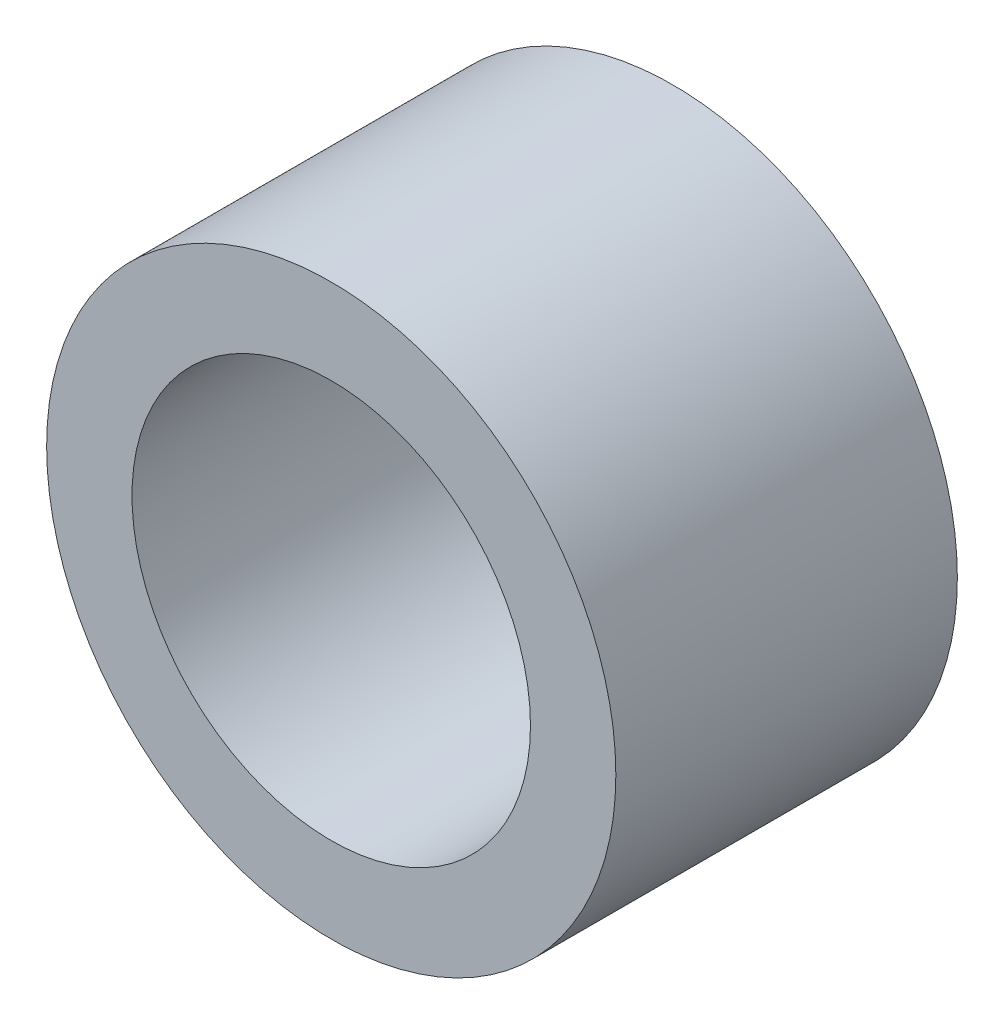
ISO-10303-21;
HEADER;
FILE_DESCRIPTION(('STEP AP214'),'2;1');
FILE_NAME('part.step','',(''),(''),'','','');
FILE_SCHEMA(('AUTOMOTIVE_DESIGN { 1 0 10303 214 1 1 1 1 }'));
ENDSEC;
DATA;
#1=APPLICATION_CONTEXT('core data for automotive mechanical design processes');
#2=APPLICATION_PROTOCOL_DEFINITION('international standard','automotive_design',2000,#1);
#3=PRODUCT_CONTEXT('',#1,'mechanical');
#4=PRODUCT('Part','Part','',(#3));
#5=PRODUCT_RELATED_PRODUCT_CATEGORY('part','',(#4));
#6=PRODUCT_DEFINITION_FORMATION('','',#4);
#7=PRODUCT_DEFINITION_CONTEXT('part definition',#1,'design');
#8=PRODUCT_DEFINITION('design','',#6,#7);
#9=PRODUCT_DEFINITION_SHAPE('','',#8);
#10=(LENGTH_UNIT() NAMED_UNIT(*) SI_UNIT(.MILLI.,.METRE.));
#11=(NAMED_UNIT(*) PLANE_ANGLE_UNIT() SI_UNIT($,.RADIAN.));
#12=(NAMED_UNIT(*) SI_UNIT($,.STERADIAN.) SOLID_ANGLE_UNIT());
#13=UNCERTAINTY_MEASURE_WITH_UNIT(LENGTH_MEASURE(1.E-05),#10,'distance_accuracy_value','');
#14=(GEOMETRIC_REPRESENTATION_CONTEXT(3) GLOBAL_UNCERTAINTY_ASSIGNED_CONTEXT((#13)) GLOBAL_UNIT_ASSIGNED_CONTEXT((#10,
#11,#12)) REPRESENTATION_CONTEXT('',''));
#15=CARTESIAN_POINT('',(0.,0.,0.));
#16=DIRECTION('',(0.,0.,1.));
#17=DIRECTION('',(1.,0.,0.));
#18=AXIS2_PLACEMENT_3D('',#15,#16,#17);
#19=CARTESIAN_POINT('',(-5.9081461872237,2.15502053550373,3.));
#20=DIRECTION('',(0.,0.,1.));
#21=DIRECTION('',(1.,0.,0.));
#22=AXIS2_PLACEMENT_3D('',#19,#20,#21);
#23=PLANE('',#22);
#24=CARTESIAN_POINT('',(-5.9081461872237,2.15502053550373,3.));
#25=DIRECTION('',(0.,0.,1.));
#26=DIRECTION('',(1.,0.,0.));
#27=AXIS2_PLACEMENT_3D('',#24,#25,#26);
#28=CIRCLE('',#27,2.5);
#29=CARTESIAN_POINT('',(-3.4081461872237,2.15502053550373,3.));
#30=VERTEX_POINT('',#29);
#31=EDGE_CURVE('E10',#30,#30,#28,.T.);
#32=ORIENTED_EDGE('',*,*,#31,.T.);
#33=EDGE_LOOP('',(#32));
#34=FACE_BOUND('',#33,.T.);
#35=CARTESIAN_POINT('',(-5.9081461872237,2.15502053550373,3.));
#36=DIRECTION('',(0.,0.,1.));
#37=DIRECTION('',(1.,0.,0.));
#38=AXIS2_PLACEMENT_3D('',#35,#36,#37);
#39=CIRCLE('',#38,1.75);
#40=CARTESIAN_POINT('',(-4.1581461872237,2.15502053550373,3.));
#41=VERTEX_POINT('',#40);
#42=EDGE_CURVE('E42',#41,#41,#39,.T.);
#43=ORIENTED_EDGE('',*,*,#42,.F.);
#44=EDGE_LOOP('',(#43));
#45=FACE_BOUND('',#44,.T.);
#46=ADVANCED_FACE('F31',(#34,#45),#23,.T.);
#47=CARTESIAN_POINT('',(-5.9081461872237,2.15502053550373,0.));
#48=DIRECTION('',(0.,0.,1.));
#49=DIRECTION('',(1.,0.,0.));
#50=AXIS2_PLACEMENT_3D('',#47,#48,#49);
#51=PLANE('',#50);
#52=CARTESIAN_POINT('',(-5.9081461872237,2.15502053550373,0.));
#53=DIRECTION('',(0.,0.,1.));
#54=DIRECTION('',(1.,0.,0.));
#55=AXIS2_PLACEMENT_3D('',#52,#53,#54);
#56=CIRCLE('',#55,2.5);
#57=CARTESIAN_POINT('',(-3.4081461872237,2.15502053550373,0.));
#58=VERTEX_POINT('',#57);
#59=EDGE_CURVE('E35',#58,#58,#56,.T.);
#60=ORIENTED_EDGE('',*,*,#59,.F.);
#61=EDGE_LOOP('',(#60));
#62=FACE_BOUND('',#61,.T.);
#63=CARTESIAN_POINT('',(-5.9081461872237,2.15502053550373,0.));
#64=DIRECTION('',(0.,0.,1.));
#65=DIRECTION('',(1.,0.,0.));
#66=AXIS2_PLACEMENT_3D('',#63,#64,#65);
#67=CIRCLE('',#66,1.75);
#68=CARTESIAN_POINT('',(-4.1581461872237,2.15502053550373,0.));
#69=VERTEX_POINT('',#68);
#70=EDGE_CURVE('E44',#69,#69,#67,.T.);
#71=ORIENTED_EDGE('',*,*,#70,.T.);
#72=EDGE_LOOP('',(#71));
#73=FACE_BOUND('',#72,.T.);
#74=ADVANCED_FACE('F54',(#62,#73),#51,.F.);
#75=CARTESIAN_POINT('',(-5.9081461872237,2.15502053550373,3.));
#76=DIRECTION('',(0.,0.,-1.));
#77=DIRECTION('',(-1.,0.,0.));
#78=AXIS2_PLACEMENT_3D('',#75,#76,#77);
#79=CYLINDRICAL_SURFACE('',#78,2.5);
#80=ORIENTED_EDGE('',*,*,#31,.F.);
#81=EDGE_LOOP('',(#80));
#82=FACE_BOUND('',#81,.T.);
#83=ORIENTED_EDGE('',*,*,#59,.T.);
#84=EDGE_LOOP('',(#83));
#85=FACE_BOUND('',#84,.T.);
#86=ADVANCED_FACE('F33',(#82,#85),#79,.T.);
#87=CARTESIAN_POINT('',(-5.9081461872237,2.15502053550373,3.));
#88=DIRECTION('',(0.,0.,-1.));
#89=DIRECTION('',(-1.,0.,0.));
#90=AXIS2_PLACEMENT_3D('',#87,#88,#89);
#91=CYLINDRICAL_SURFACE('',#90,1.75);
#92=ORIENTED_EDGE('',*,*,#42,.T.);
#93=EDGE_LOOP('',(#92));
#94=FACE_BOUND('',#93,.T.);
#95=ORIENTED_EDGE('',*,*,#70,.F.);
#96=EDGE_LOOP('',(#95));
#97=FACE_BOUND('',#96,.T.);
#98=ADVANCED_FACE('F50',(#94,#97),#91,.F.);
#99=CLOSED_SHELL('',(#46,#74,#86,#98));
#100=MANIFOLD_SOLID_BREP('B2',#99);
#101=ADVANCED_BREP_SHAPE_REPRESENTATION('',(#18,#100),#14);
#102=SHAPE_DEFINITION_REPRESENTATION(#9,#101);
ENDSEC;
END-ISO-10303-21;
